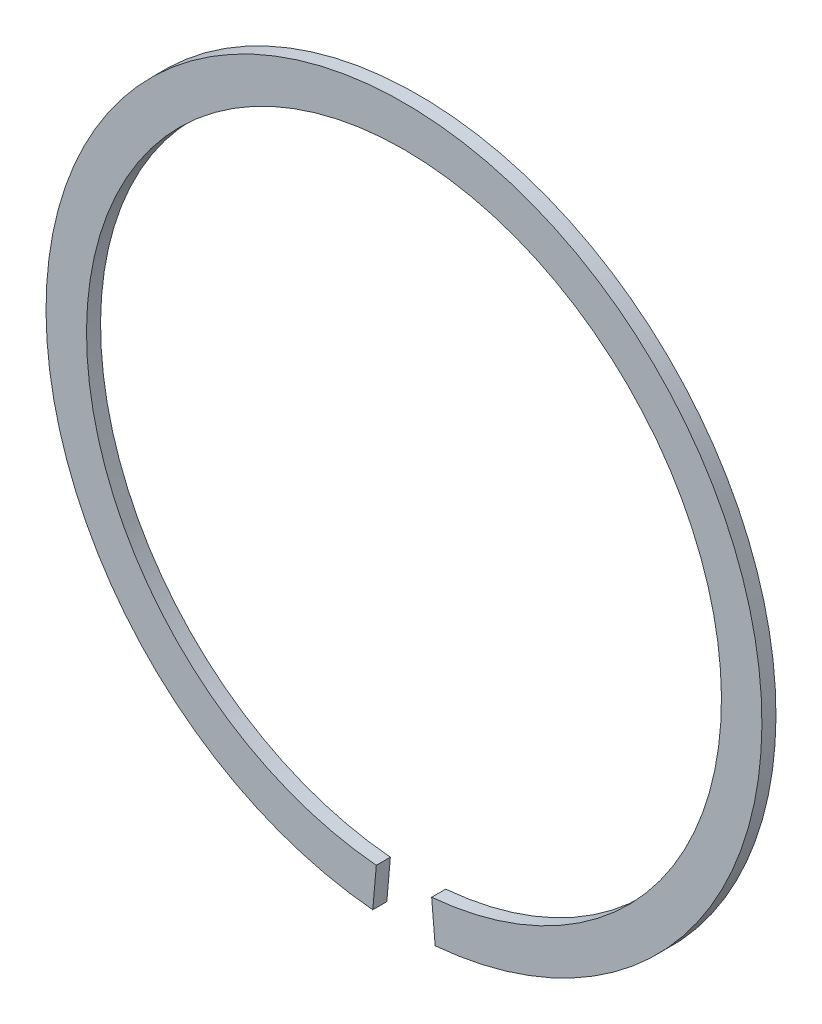
ISO-10303-21;
HEADER;
FILE_DESCRIPTION(('STEP AP214'),'2;1');
FILE_NAME('part.step','',(''),(''),'','','');
FILE_SCHEMA(('AUTOMOTIVE_DESIGN { 1 0 10303 214 1 1 1 1 }'));
ENDSEC;
DATA;
#1=APPLICATION_CONTEXT('core data for automotive mechanical design processes');
#2=APPLICATION_PROTOCOL_DEFINITION('international standard','automotive_design',2000,#1);
#3=PRODUCT_CONTEXT('',#1,'mechanical');
#4=PRODUCT('Part','Part','',(#3));
#5=PRODUCT_RELATED_PRODUCT_CATEGORY('part','',(#4));
#6=PRODUCT_DEFINITION_FORMATION('','',#4);
#7=PRODUCT_DEFINITION_CONTEXT('part definition',#1,'design');
#8=PRODUCT_DEFINITION('design','',#6,#7);
#9=PRODUCT_DEFINITION_SHAPE('','',#8);
#10=(LENGTH_UNIT() NAMED_UNIT(*) SI_UNIT(.MILLI.,.METRE.));
#11=(NAMED_UNIT(*) PLANE_ANGLE_UNIT() SI_UNIT($,.RADIAN.));
#12=(NAMED_UNIT(*) SI_UNIT($,.STERADIAN.) SOLID_ANGLE_UNIT());
#13=UNCERTAINTY_MEASURE_WITH_UNIT(LENGTH_MEASURE(1.E-05),#10,'distance_accuracy_value','');
#14=(GEOMETRIC_REPRESENTATION_CONTEXT(3) GLOBAL_UNCERTAINTY_ASSIGNED_CONTEXT((#13)) GLOBAL_UNIT_ASSIGNED_CONTEXT((#10,
#11,#12)) REPRESENTATION_CONTEXT('',''));
#15=CARTESIAN_POINT('',(0.,0.,0.));
#16=DIRECTION('',(0.,0.,1.));
#17=DIRECTION('',(1.,0.,0.));
#18=AXIS2_PLACEMENT_3D('',#15,#16,#17);
#19=CARTESIAN_POINT('',(3.3472163002238,-38.258857380213,1.7));
#20=DIRECTION('',(0.996194698091747,0.0871557427476448,0.));
#21=DIRECTION('',(-0.0871557427476448,0.996194698091747,0.));
#22=AXIS2_PLACEMENT_3D('',#19,#20,#21);
#23=PLANE('',#22);
#24=DIRECTION('',(0.0871557427476449,-0.996194698091747,0.));
#25=VECTOR('',#24,1.);
#26=CARTESIAN_POINT('',(3.3472163002238,-38.258857380213,0.));
#27=LINE('',#26,#25);
#28=CARTESIAN_POINT('',(3.34721630022378,-38.258857380213,0.));
#29=VERTEX_POINT('',#28);
#30=CARTESIAN_POINT('',(3.77384366097357,-43.135230427373,0.));
#31=VERTEX_POINT('',#30);
#32=EDGE_CURVE('E13',#29,#31,#27,.T.);
#33=ORIENTED_EDGE('',*,*,#32,.T.);
#34=DIRECTION('',(0.,0.,-1.));
#35=VECTOR('',#34,1.);
#36=CARTESIAN_POINT('',(3.77384366097357,-43.135230427373,1.7));
#37=LINE('',#36,#35);
#38=CARTESIAN_POINT('',(3.77384366097357,-43.135230427373,1.7));
#39=VERTEX_POINT('',#38);
#40=EDGE_CURVE('E33',#39,#31,#37,.T.);
#41=ORIENTED_EDGE('',*,*,#40,.F.);
#42=DIRECTION('',(0.0871557427476449,-0.996194698091747,0.));
#43=VECTOR('',#42,1.);
#44=CARTESIAN_POINT('',(3.3472163002238,-38.258857380213,1.7));
#45=LINE('',#44,#43);
#46=CARTESIAN_POINT('',(3.34721630022378,-38.258857380213,1.7));
#47=VERTEX_POINT('',#46);
#48=EDGE_CURVE('E102',#47,#39,#45,.T.);
#49=ORIENTED_EDGE('',*,*,#48,.F.);
#50=DIRECTION('',(0.,0.,-1.));
#51=VECTOR('',#50,1.);
#52=CARTESIAN_POINT('',(3.34721630022378,-38.258857380213,1.7));
#53=LINE('',#52,#51);
#54=EDGE_CURVE('E98',#47,#29,#53,.T.);
#55=ORIENTED_EDGE('',*,*,#54,.T.);
#56=EDGE_LOOP('',(#33,#41,#49,#55));
#57=FACE_BOUND('',#56,.T.);
#58=ADVANCED_FACE('F25',(#57),#23,.F.);
#59=CARTESIAN_POINT('',(0.,2.44352064623921E-13,1.7));
#60=DIRECTION('',(0.,0.,-1.));
#61=DIRECTION('',(0.,-1.,0.));
#62=AXIS2_PLACEMENT_3D('',#59,#60,#61);
#63=CYLINDRICAL_SURFACE('',#62,38.405);
#64=CARTESIAN_POINT('',(0.,2.44352064623921E-13,0.));
#65=DIRECTION('',(0.,0.,1.));
#66=DIRECTION('',(1.,0.,0.));
#67=AXIS2_PLACEMENT_3D('',#64,#65,#66);
#68=CIRCLE('',#67,38.405);
#69=CARTESIAN_POINT('',(-3.3472163002238,-38.258857380213,0.));
#70=VERTEX_POINT('',#69);
#71=EDGE_CURVE('E81',#29,#70,#68,.T.);
#72=ORIENTED_EDGE('',*,*,#71,.F.);
#73=ORIENTED_EDGE('',*,*,#54,.F.);
#74=CARTESIAN_POINT('',(0.,2.44352064623921E-13,1.7));
#75=DIRECTION('',(0.,0.,1.));
#76=DIRECTION('',(1.,0.,0.));
#77=AXIS2_PLACEMENT_3D('',#74,#75,#76);
#78=CIRCLE('',#77,38.405);
#79=CARTESIAN_POINT('',(-3.3472163002238,-38.258857380213,1.7));
#80=VERTEX_POINT('',#79);
#81=EDGE_CURVE('E84',#47,#80,#78,.T.);
#82=ORIENTED_EDGE('',*,*,#81,.T.);
#83=DIRECTION('',(0.,0.,-1.));
#84=VECTOR('',#83,1.);
#85=CARTESIAN_POINT('',(-3.3472163002238,-38.258857380213,1.7));
#86=LINE('',#85,#84);
#87=EDGE_CURVE('E82',#80,#70,#86,.T.);
#88=ORIENTED_EDGE('',*,*,#87,.T.);
#89=EDGE_LOOP('',(#72,#73,#82,#88));
#90=FACE_BOUND('',#89,.T.);
#91=ADVANCED_FACE('F116',(#90),#63,.F.);
#92=CARTESIAN_POINT('',(-3.7738436609736,-43.135230427373,1.7));
#93=DIRECTION('',(-0.996194698091747,0.0871557427476448,0.));
#94=DIRECTION('',(-0.0871557427476448,-0.996194698091747,0.));
#95=AXIS2_PLACEMENT_3D('',#92,#93,#94);
#96=PLANE('',#95);
#97=DIRECTION('',(0.0871557427476449,0.996194698091747,0.));
#98=VECTOR('',#97,1.);
#99=CARTESIAN_POINT('',(-3.7738436609736,-43.135230427373,0.));
#100=LINE('',#99,#98);
#101=CARTESIAN_POINT('',(-3.77384366097362,-43.135230427373,0.));
#102=VERTEX_POINT('',#101);
#103=EDGE_CURVE('E67',#102,#70,#100,.T.);
#104=ORIENTED_EDGE('',*,*,#103,.T.);
#105=ORIENTED_EDGE('',*,*,#87,.F.);
#106=DIRECTION('',(0.0871557427476449,0.996194698091747,0.));
#107=VECTOR('',#106,1.);
#108=CARTESIAN_POINT('',(-3.7738436609736,-43.135230427373,1.7));
#109=LINE('',#108,#107);
#110=CARTESIAN_POINT('',(-3.77384366097362,-43.135230427373,1.7));
#111=VERTEX_POINT('',#110);
#112=EDGE_CURVE('E70',#111,#80,#109,.T.);
#113=ORIENTED_EDGE('',*,*,#112,.F.);
#114=DIRECTION('',(0.,0.,-1.));
#115=VECTOR('',#114,1.);
#116=CARTESIAN_POINT('',(-3.77384366097362,-43.135230427373,1.7));
#117=LINE('',#116,#115);
#118=EDGE_CURVE('E62',#111,#102,#117,.T.);
#119=ORIENTED_EDGE('',*,*,#118,.T.);
#120=EDGE_LOOP('',(#104,#105,#113,#119));
#121=FACE_BOUND('',#120,.T.);
#122=ADVANCED_FACE('F64',(#121),#96,.F.);
#123=CARTESIAN_POINT('',(0.,-2.10619824532466E-13,1.7));
#124=DIRECTION('',(0.,0.,-1.));
#125=DIRECTION('',(0.,-1.,0.));
#126=AXIS2_PLACEMENT_3D('',#123,#124,#125);
#127=CYLINDRICAL_SURFACE('',#126,43.3);
#128=CARTESIAN_POINT('',(0.,-2.10619824532466E-13,0.));
#129=DIRECTION('',(0.,0.,1.));
#130=DIRECTION('',(1.,0.,0.));
#131=AXIS2_PLACEMENT_3D('',#128,#129,#130);
#132=CIRCLE('',#131,43.3);
#133=EDGE_CURVE('E73',#31,#102,#132,.T.);
#134=ORIENTED_EDGE('',*,*,#133,.T.);
#135=ORIENTED_EDGE('',*,*,#118,.F.);
#136=CARTESIAN_POINT('',(0.,-2.10619824532466E-13,1.7));
#137=DIRECTION('',(0.,0.,1.));
#138=DIRECTION('',(1.,0.,0.));
#139=AXIS2_PLACEMENT_3D('',#136,#137,#138);
#140=CIRCLE('',#139,43.3);
#141=EDGE_CURVE('E77',#39,#111,#140,.T.);
#142=ORIENTED_EDGE('',*,*,#141,.F.);
#143=ORIENTED_EDGE('',*,*,#40,.T.);
#144=EDGE_LOOP('',(#134,#135,#142,#143));
#145=FACE_BOUND('',#144,.T.);
#146=ADVANCED_FACE('F75',(#145),#127,.T.);
#147=CARTESIAN_POINT('',(0.,-2.10619824532466E-13,1.7));
#148=DIRECTION('',(0.,0.,1.));
#149=DIRECTION('',(1.,0.,0.));
#150=AXIS2_PLACEMENT_3D('',#147,#148,#149);
#151=PLANE('',#150);
#152=ORIENTED_EDGE('',*,*,#48,.T.);
#153=ORIENTED_EDGE('',*,*,#141,.T.);
#154=ORIENTED_EDGE('',*,*,#112,.T.);
#155=ORIENTED_EDGE('',*,*,#81,.F.);
#156=EDGE_LOOP('',(#152,#153,#154,#155));
#157=FACE_BOUND('',#156,.T.);
#158=ADVANCED_FACE('F113',(#157),#151,.T.);
#159=CARTESIAN_POINT('',(0.,-2.10619824532466E-13,0.));
#160=DIRECTION('',(0.,0.,1.));
#161=DIRECTION('',(1.,0.,0.));
#162=AXIS2_PLACEMENT_3D('',#159,#160,#161);
#163=PLANE('',#162);
#164=ORIENTED_EDGE('',*,*,#32,.F.);
#165=ORIENTED_EDGE('',*,*,#71,.T.);
#166=ORIENTED_EDGE('',*,*,#103,.F.);
#167=ORIENTED_EDGE('',*,*,#133,.F.);
#168=EDGE_LOOP('',(#164,#165,#166,#167));
#169=FACE_BOUND('',#168,.T.);
#170=ADVANCED_FACE('F79',(#169),#163,.F.);
#171=CLOSED_SHELL('',(#58,#91,#122,#146,#158,#170));
#172=MANIFOLD_SOLID_BREP('B1',#171);
#173=ADVANCED_BREP_SHAPE_REPRESENTATION('',(#18,#172),#14);
#174=SHAPE_DEFINITION_REPRESENTATION(#9,#173);
ENDSEC;
END-ISO-10303-21;
